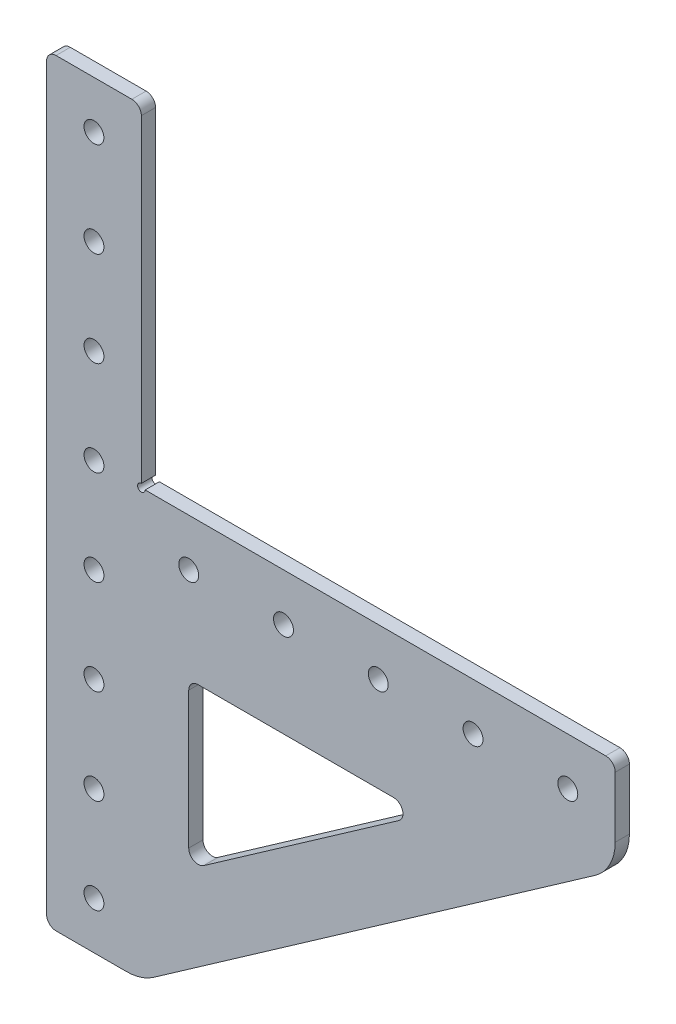
ISO-10303-21;
HEADER;
FILE_DESCRIPTION(('STEP AP214'),'2;1');
FILE_NAME('part.step','',(''),(''),'','','');
FILE_SCHEMA(('AUTOMOTIVE_DESIGN { 1 0 10303 214 1 1 1 1 }'));
ENDSEC;
DATA;
#1=APPLICATION_CONTEXT('core data for automotive mechanical design processes');
#2=APPLICATION_PROTOCOL_DEFINITION('international standard','automotive_design',2000,#1);
#3=PRODUCT_CONTEXT('',#1,'mechanical');
#4=PRODUCT('Part','Part','',(#3));
#5=PRODUCT_RELATED_PRODUCT_CATEGORY('part','',(#4));
#6=PRODUCT_DEFINITION_FORMATION('','',#4);
#7=PRODUCT_DEFINITION_CONTEXT('part definition',#1,'design');
#8=PRODUCT_DEFINITION('design','',#6,#7);
#9=PRODUCT_DEFINITION_SHAPE('','',#8);
#10=(LENGTH_UNIT() NAMED_UNIT(*) SI_UNIT(.MILLI.,.METRE.));
#11=(NAMED_UNIT(*) PLANE_ANGLE_UNIT() SI_UNIT($,.RADIAN.));
#12=(NAMED_UNIT(*) SI_UNIT($,.STERADIAN.) SOLID_ANGLE_UNIT());
#13=UNCERTAINTY_MEASURE_WITH_UNIT(LENGTH_MEASURE(1.E-05),#10,'distance_accuracy_value','');
#14=(GEOMETRIC_REPRESENTATION_CONTEXT(3) GLOBAL_UNCERTAINTY_ASSIGNED_CONTEXT((#13)) GLOBAL_UNIT_ASSIGNED_CONTEXT((#10,
#11,#12)) REPRESENTATION_CONTEXT('',''));
#15=CARTESIAN_POINT('',(0.,0.,0.));
#16=DIRECTION('',(0.,0.,1.));
#17=DIRECTION('',(1.,0.,0.));
#18=AXIS2_PLACEMENT_3D('',#15,#16,#17);
#19=CARTESIAN_POINT('',(0.,0.,3.));
#20=DIRECTION('',(0.,0.,-1.));
#21=DIRECTION('',(-1.,0.,0.));
#22=AXIS2_PLACEMENT_3D('',#19,#20,#21);
#23=PLANE('',#22);
#24=DIRECTION('',(0.,1.,0.));
#25=VECTOR('',#24,1.);
#26=CARTESIAN_POINT('',(-90.,-20.,3.));
#27=LINE('',#26,#25);
#28=CARTESIAN_POINT('',(-90.,-50.8488554532527,3.));
#29=VERTEX_POINT('',#28);
#30=CARTESIAN_POINT('',(-90.,-22.,3.));
#31=VERTEX_POINT('',#30);
#32=EDGE_CURVE('E475',#29,#31,#27,.T.);
#33=ORIENTED_EDGE('',*,*,#32,.T.);
#34=CARTESIAN_POINT('',(-88.,-22.,3.));
#35=DIRECTION('',(0.,0.,-1.));
#36=DIRECTION('',(-1.,0.,0.));
#37=AXIS2_PLACEMENT_3D('',#34,#35,#36);
#38=CIRCLE('',#37,2.);
#39=CARTESIAN_POINT('',(-88.,-20.,3.));
#40=VERTEX_POINT('',#39);
#41=EDGE_CURVE('E290',#31,#40,#38,.T.);
#42=ORIENTED_EDGE('',*,*,#41,.T.);
#43=DIRECTION('',(1.,0.,0.));
#44=VECTOR('',#43,1.);
#45=CARTESIAN_POINT('',(-40.4426191765722,-20.,3.));
#46=LINE('',#45,#44);
#47=CARTESIAN_POINT('',(-46.7873493524961,-20.,3.));
#48=VERTEX_POINT('',#47);
#49=EDGE_CURVE('E461',#40,#48,#46,.T.);
#50=ORIENTED_EDGE('',*,*,#49,.T.);
#51=CARTESIAN_POINT('',(-46.7873493524961,-22.,3.));
#52=DIRECTION('',(0.,0.,-1.));
#53=DIRECTION('',(-1.,0.,0.));
#54=AXIS2_PLACEMENT_3D('',#51,#52,#53);
#55=CIRCLE('',#54,2.);
#56=CARTESIAN_POINT('',(-45.6404246637695,-23.6384638410381,3.));
#57=VERTEX_POINT('',#56);
#58=EDGE_CURVE('E286',#48,#57,#55,.T.);
#59=ORIENTED_EDGE('',*,*,#58,.T.);
#60=DIRECTION('',(-0.819231920519041,-0.573462344363328,0.));
#61=VECTOR('',#60,1.);
#62=CARTESIAN_POINT('',(-40.4426191765722,-20.,3.));
#63=LINE('',#62,#61);
#64=CARTESIAN_POINT('',(-86.8530753112733,-52.4873192942908,3.));
#65=VERTEX_POINT('',#64);
#66=EDGE_CURVE('E466',#57,#65,#63,.T.);
#67=ORIENTED_EDGE('',*,*,#66,.T.);
#68=CARTESIAN_POINT('',(-88.,-50.8488554532527,3.));
#69=DIRECTION('',(0.,0.,-1.));
#70=DIRECTION('',(-1.,0.,0.));
#71=AXIS2_PLACEMENT_3D('',#68,#69,#70);
#72=CIRCLE('',#71,2.);
#73=EDGE_CURVE('E282',#65,#29,#72,.T.);
#74=ORIENTED_EDGE('',*,*,#73,.T.);
#75=EDGE_LOOP('',(#33,#42,#50,#59,#67,#74));
#76=FACE_BOUND('',#75,.T.);
#77=DIRECTION('',(1.,0.,0.));
#78=VECTOR('',#77,1.);
#79=CARTESIAN_POINT('',(-100.,-80.,3.));
#80=LINE('',#79,#78);
#81=CARTESIAN_POINT('',(-118.,-80.,3.));
#82=VERTEX_POINT('',#81);
#83=CARTESIAN_POINT('',(-103.152222308191,-80.,3.));
#84=VERTEX_POINT('',#83);
#85=EDGE_CURVE('E203',#82,#84,#80,.T.);
#86=ORIENTED_EDGE('',*,*,#85,.T.);
#87=CARTESIAN_POINT('',(-103.152222308191,-70.,3.));
#88=DIRECTION('',(0.,0.,-1.));
#89=DIRECTION('',(-1.,0.,0.));
#90=AXIS2_PLACEMENT_3D('',#87,#88,#89);
#91=CIRCLE('',#90,10.);
#92=CARTESIAN_POINT('',(-97.4175988645577,-78.1923192051904,3.));
#93=VERTEX_POINT('',#92);
#94=EDGE_CURVE('E41',#84,#93,#91,.F.);
#95=ORIENTED_EDGE('',*,*,#94,.T.);
#96=DIRECTION('',(0.81923192051904,0.573462344363328,0.));
#97=VECTOR('',#96,1.);
#98=CARTESIAN_POINT('',(0.,-10.,3.));
#99=LINE('',#98,#97);
#100=CARTESIAN_POINT('',(-4.26537655636672,-12.9857635894567,3.));
#101=VERTEX_POINT('',#100);
#102=EDGE_CURVE('E182',#93,#101,#99,.T.);
#103=ORIENTED_EDGE('',*,*,#102,.T.);
#104=CARTESIAN_POINT('',(-10.,-4.7934443842663,3.));
#105=DIRECTION('',(0.,0.,-1.));
#106=DIRECTION('',(-1.,0.,0.));
#107=AXIS2_PLACEMENT_3D('',#104,#105,#106);
#108=CIRCLE('',#107,10.);
#109=CARTESIAN_POINT('',(0.,-4.7934443842663,3.));
#110=VERTEX_POINT('',#109);
#111=EDGE_CURVE('E48',#101,#110,#108,.F.);
#112=ORIENTED_EDGE('',*,*,#111,.T.);
#113=DIRECTION('',(0.,1.,0.));
#114=VECTOR('',#113,1.);
#115=CARTESIAN_POINT('',(0.,10.,3.));
#116=LINE('',#115,#114);
#117=CARTESIAN_POINT('',(0.,8.,3.));
#118=VERTEX_POINT('',#117);
#119=EDGE_CURVE('E199',#110,#118,#116,.T.);
#120=ORIENTED_EDGE('',*,*,#119,.T.);
#121=CARTESIAN_POINT('',(-2.,8.,3.));
#122=DIRECTION('',(0.,0.,-1.));
#123=DIRECTION('',(-1.,0.,0.));
#124=AXIS2_PLACEMENT_3D('',#121,#122,#123);
#125=CIRCLE('',#124,2.);
#126=CARTESIAN_POINT('',(-2.,10.,3.));
#127=VERTEX_POINT('',#126);
#128=EDGE_CURVE('E197',#118,#127,#125,.F.);
#129=ORIENTED_EDGE('',*,*,#128,.T.);
#130=DIRECTION('',(-1.,0.,0.));
#131=VECTOR('',#130,1.);
#132=CARTESIAN_POINT('',(0.,10.,3.));
#133=LINE('',#132,#131);
#134=CARTESIAN_POINT('',(-99.2,9.99999999999999,3.));
#135=VERTEX_POINT('',#134);
#136=EDGE_CURVE('E189',#127,#135,#133,.T.);
#137=ORIENTED_EDGE('',*,*,#136,.T.);
#138=CARTESIAN_POINT('',(-100.,9.99999999999999,3.));
#139=DIRECTION('',(0.,0.,1.));
#140=DIRECTION('',(1.,0.,0.));
#141=AXIS2_PLACEMENT_3D('',#138,#139,#140);
#142=CIRCLE('',#141,0.799999999999995);
#143=CARTESIAN_POINT('',(-100.,10.8,3.));
#144=VERTEX_POINT('',#143);
#145=EDGE_CURVE('E172',#144,#135,#142,.T.);
#146=ORIENTED_EDGE('',*,*,#145,.F.);
#147=DIRECTION('',(0.,1.,0.));
#148=VECTOR('',#147,1.);
#149=CARTESIAN_POINT('',(-100.,9.99999999999999,3.));
#150=LINE('',#149,#148);
#151=CARTESIAN_POINT('',(-100.,78.,3.));
#152=VERTEX_POINT('',#151);
#153=EDGE_CURVE('E198',#144,#152,#150,.T.);
#154=ORIENTED_EDGE('',*,*,#153,.T.);
#155=CARTESIAN_POINT('',(-102.,78.,3.));
#156=DIRECTION('',(0.,0.,-1.));
#157=DIRECTION('',(-1.,0.,0.));
#158=AXIS2_PLACEMENT_3D('',#155,#156,#157);
#159=CIRCLE('',#158,2.);
#160=CARTESIAN_POINT('',(-102.,80.,3.));
#161=VERTEX_POINT('',#160);
#162=EDGE_CURVE('E247',#152,#161,#159,.F.);
#163=ORIENTED_EDGE('',*,*,#162,.T.);
#164=DIRECTION('',(-1.,0.,0.));
#165=VECTOR('',#164,1.);
#166=CARTESIAN_POINT('',(-100.,80.,3.));
#167=LINE('',#166,#165);
#168=CARTESIAN_POINT('',(-118.,80.,3.));
#169=VERTEX_POINT('',#168);
#170=EDGE_CURVE('E201',#161,#169,#167,.T.);
#171=ORIENTED_EDGE('',*,*,#170,.T.);
#172=CARTESIAN_POINT('',(-118.,78.,3.));
#173=DIRECTION('',(0.,0.,-1.));
#174=DIRECTION('',(-1.,0.,0.));
#175=AXIS2_PLACEMENT_3D('',#172,#173,#174);
#176=CIRCLE('',#175,2.);
#177=CARTESIAN_POINT('',(-120.,78.,3.));
#178=VERTEX_POINT('',#177);
#179=EDGE_CURVE('E244',#169,#178,#176,.F.);
#180=ORIENTED_EDGE('',*,*,#179,.T.);
#181=DIRECTION('',(0.,-1.,0.));
#182=VECTOR('',#181,1.);
#183=CARTESIAN_POINT('',(-120.,-80.,3.));
#184=LINE('',#183,#182);
#185=CARTESIAN_POINT('',(-120.,-78.,3.));
#186=VERTEX_POINT('',#185);
#187=EDGE_CURVE('E209',#178,#186,#184,.T.);
#188=ORIENTED_EDGE('',*,*,#187,.T.);
#189=CARTESIAN_POINT('',(-118.,-78.,3.));
#190=DIRECTION('',(0.,0.,-1.));
#191=DIRECTION('',(-1.,0.,0.));
#192=AXIS2_PLACEMENT_3D('',#189,#190,#191);
#193=CIRCLE('',#192,2.);
#194=EDGE_CURVE('E249',#186,#82,#193,.F.);
#195=ORIENTED_EDGE('',*,*,#194,.T.);
#196=EDGE_LOOP('',(#86,#95,#103,#112,#120,#129,#137,#146,#154,#163,#171,#180,#188,#195));
#197=FACE_BOUND('',#196,.T.);
#198=CARTESIAN_POINT('',(-110.,70.,3.));
#199=DIRECTION('',(0.,0.,1.));
#200=DIRECTION('',(1.,0.,0.));
#201=AXIS2_PLACEMENT_3D('',#198,#199,#200);
#202=CIRCLE('',#201,2.1);
#203=CARTESIAN_POINT('',(-107.9,70.,3.));
#204=VERTEX_POINT('',#203);
#205=EDGE_CURVE('E216',#204,#204,#202,.T.);
#206=ORIENTED_EDGE('',*,*,#205,.F.);
#207=EDGE_LOOP('',(#206));
#208=FACE_BOUND('',#207,.T.);
#209=CARTESIAN_POINT('',(-10.,0.,3.));
#210=DIRECTION('',(0.,0.,1.));
#211=DIRECTION('',(1.,0.,0.));
#212=AXIS2_PLACEMENT_3D('',#209,#210,#211);
#213=CIRCLE('',#212,2.1);
#214=CARTESIAN_POINT('',(-7.9,0.,3.));
#215=VERTEX_POINT('',#214);
#216=EDGE_CURVE('E386',#215,#215,#213,.T.);
#217=ORIENTED_EDGE('',*,*,#216,.F.);
#218=EDGE_LOOP('',(#217));
#219=FACE_BOUND('',#218,.T.);
#220=CARTESIAN_POINT('',(-110.,50.,3.));
#221=DIRECTION('',(0.,0.,1.));
#222=DIRECTION('',(1.,0.,0.));
#223=AXIS2_PLACEMENT_3D('',#220,#221,#222);
#224=CIRCLE('',#223,2.1);
#225=CARTESIAN_POINT('',(-107.9,50.,3.));
#226=VERTEX_POINT('',#225);
#227=EDGE_CURVE('E394',#226,#226,#224,.T.);
#228=ORIENTED_EDGE('',*,*,#227,.F.);
#229=EDGE_LOOP('',(#228));
#230=FACE_BOUND('',#229,.T.);
#231=CARTESIAN_POINT('',(-110.,30.,3.));
#232=DIRECTION('',(0.,0.,1.));
#233=DIRECTION('',(1.,0.,0.));
#234=AXIS2_PLACEMENT_3D('',#231,#232,#233);
#235=CIRCLE('',#234,2.10000000000002);
#236=CARTESIAN_POINT('',(-107.9,30.,3.));
#237=VERTEX_POINT('',#236);
#238=EDGE_CURVE('E399',#237,#237,#235,.T.);
#239=ORIENTED_EDGE('',*,*,#238,.F.);
#240=EDGE_LOOP('',(#239));
#241=FACE_BOUND('',#240,.T.);
#242=CARTESIAN_POINT('',(-110.,10.,3.));
#243=DIRECTION('',(0.,0.,1.));
#244=DIRECTION('',(1.,0.,0.));
#245=AXIS2_PLACEMENT_3D('',#242,#243,#244);
#246=CIRCLE('',#245,2.1);
#247=CARTESIAN_POINT('',(-107.9,10.,3.));
#248=VERTEX_POINT('',#247);
#249=EDGE_CURVE('E405',#248,#248,#246,.T.);
#250=ORIENTED_EDGE('',*,*,#249,.F.);
#251=EDGE_LOOP('',(#250));
#252=FACE_BOUND('',#251,.T.);
#253=CARTESIAN_POINT('',(-110.,-9.99999999999999,3.));
#254=DIRECTION('',(0.,0.,1.));
#255=DIRECTION('',(1.,0.,0.));
#256=AXIS2_PLACEMENT_3D('',#253,#254,#255);
#257=CIRCLE('',#256,2.1);
#258=CARTESIAN_POINT('',(-107.9,-9.99999999999999,3.));
#259=VERTEX_POINT('',#258);
#260=EDGE_CURVE('E411',#259,#259,#257,.T.);
#261=ORIENTED_EDGE('',*,*,#260,.F.);
#262=EDGE_LOOP('',(#261));
#263=FACE_BOUND('',#262,.T.);
#264=CARTESIAN_POINT('',(-110.,-30.,3.));
#265=DIRECTION('',(0.,0.,1.));
#266=DIRECTION('',(1.,0.,0.));
#267=AXIS2_PLACEMENT_3D('',#264,#265,#266);
#268=CIRCLE('',#267,2.1);
#269=CARTESIAN_POINT('',(-107.9,-30.,3.));
#270=VERTEX_POINT('',#269);
#271=EDGE_CURVE('E417',#270,#270,#268,.T.);
#272=ORIENTED_EDGE('',*,*,#271,.F.);
#273=EDGE_LOOP('',(#272));
#274=FACE_BOUND('',#273,.T.);
#275=CARTESIAN_POINT('',(-110.,-50.,3.));
#276=DIRECTION('',(0.,0.,1.));
#277=DIRECTION('',(1.,0.,0.));
#278=AXIS2_PLACEMENT_3D('',#275,#276,#277);
#279=CIRCLE('',#278,2.09999999999999);
#280=CARTESIAN_POINT('',(-107.9,-50.,3.));
#281=VERTEX_POINT('',#280);
#282=EDGE_CURVE('E423',#281,#281,#279,.T.);
#283=ORIENTED_EDGE('',*,*,#282,.F.);
#284=EDGE_LOOP('',(#283));
#285=FACE_BOUND('',#284,.T.);
#286=CARTESIAN_POINT('',(-110.,-70.,3.));
#287=DIRECTION('',(0.,0.,1.));
#288=DIRECTION('',(1.,0.,0.));
#289=AXIS2_PLACEMENT_3D('',#286,#287,#288);
#290=CIRCLE('',#289,2.1);
#291=CARTESIAN_POINT('',(-107.9,-70.,3.));
#292=VERTEX_POINT('',#291);
#293=EDGE_CURVE('E429',#292,#292,#290,.T.);
#294=ORIENTED_EDGE('',*,*,#293,.F.);
#295=EDGE_LOOP('',(#294));
#296=FACE_BOUND('',#295,.T.);
#297=CARTESIAN_POINT('',(-30.,0.,3.));
#298=DIRECTION('',(0.,0.,1.));
#299=DIRECTION('',(1.,0.,0.));
#300=AXIS2_PLACEMENT_3D('',#297,#298,#299);
#301=CIRCLE('',#300,2.1);
#302=CARTESIAN_POINT('',(-27.9,0.,3.));
#303=VERTEX_POINT('',#302);
#304=EDGE_CURVE('E435',#303,#303,#301,.T.);
#305=ORIENTED_EDGE('',*,*,#304,.F.);
#306=EDGE_LOOP('',(#305));
#307=FACE_BOUND('',#306,.T.);
#308=CARTESIAN_POINT('',(-50.,0.,3.));
#309=DIRECTION('',(0.,0.,1.));
#310=DIRECTION('',(1.,0.,0.));
#311=AXIS2_PLACEMENT_3D('',#308,#309,#310);
#312=CIRCLE('',#311,2.1);
#313=CARTESIAN_POINT('',(-47.9,0.,3.));
#314=VERTEX_POINT('',#313);
#315=EDGE_CURVE('E441',#314,#314,#312,.T.);
#316=ORIENTED_EDGE('',*,*,#315,.F.);
#317=EDGE_LOOP('',(#316));
#318=FACE_BOUND('',#317,.T.);
#319=CARTESIAN_POINT('',(-70.,0.,3.));
#320=DIRECTION('',(0.,0.,1.));
#321=DIRECTION('',(1.,0.,0.));
#322=AXIS2_PLACEMENT_3D('',#319,#320,#321);
#323=CIRCLE('',#322,2.1);
#324=CARTESIAN_POINT('',(-67.9,0.,3.));
#325=VERTEX_POINT('',#324);
#326=EDGE_CURVE('E447',#325,#325,#323,.T.);
#327=ORIENTED_EDGE('',*,*,#326,.F.);
#328=EDGE_LOOP('',(#327));
#329=FACE_BOUND('',#328,.T.);
#330=CARTESIAN_POINT('',(-90.,0.,3.));
#331=DIRECTION('',(0.,0.,1.));
#332=DIRECTION('',(1.,0.,0.));
#333=AXIS2_PLACEMENT_3D('',#330,#331,#332);
#334=CIRCLE('',#333,2.09999999999999);
#335=CARTESIAN_POINT('',(-87.9,0.,3.));
#336=VERTEX_POINT('',#335);
#337=EDGE_CURVE('E453',#336,#336,#334,.T.);
#338=ORIENTED_EDGE('',*,*,#337,.F.);
#339=EDGE_LOOP('',(#338));
#340=FACE_BOUND('',#339,.T.);
#341=ADVANCED_FACE('F33',(#76,#197,#208,#219,#230,#241,#252,#263,#274,#285,#296,#307,#318,#329,
#340),#23,.F.);
#342=CARTESIAN_POINT('',(0.,0.,0.));
#343=DIRECTION('',(0.,0.,-1.));
#344=DIRECTION('',(-1.,0.,0.));
#345=AXIS2_PLACEMENT_3D('',#342,#343,#344);
#346=PLANE('',#345);
#347=DIRECTION('',(-0.819231920519041,-0.573462344363328,0.));
#348=VECTOR('',#347,1.);
#349=CARTESIAN_POINT('',(-40.4426191765722,-20.,0.));
#350=LINE('',#349,#348);
#351=CARTESIAN_POINT('',(-45.6404246637695,-23.6384638410381,0.));
#352=VERTEX_POINT('',#351);
#353=CARTESIAN_POINT('',(-86.8530753112733,-52.4873192942908,0.));
#354=VERTEX_POINT('',#353);
#355=EDGE_CURVE('E470',#352,#354,#350,.T.);
#356=ORIENTED_EDGE('',*,*,#355,.F.);
#357=CARTESIAN_POINT('',(-46.7873493524961,-22.,0.));
#358=DIRECTION('',(0.,0.,-1.));
#359=DIRECTION('',(-1.,0.,0.));
#360=AXIS2_PLACEMENT_3D('',#357,#358,#359);
#361=CIRCLE('',#360,2.);
#362=CARTESIAN_POINT('',(-46.7873493524961,-20.,0.));
#363=VERTEX_POINT('',#362);
#364=EDGE_CURVE('E284',#352,#363,#361,.F.);
#365=ORIENTED_EDGE('',*,*,#364,.T.);
#366=DIRECTION('',(1.,0.,0.));
#367=VECTOR('',#366,1.);
#368=CARTESIAN_POINT('',(-40.4426191765722,-20.,0.));
#369=LINE('',#368,#367);
#370=CARTESIAN_POINT('',(-88.,-20.,0.));
#371=VERTEX_POINT('',#370);
#372=EDGE_CURVE('E463',#371,#363,#369,.T.);
#373=ORIENTED_EDGE('',*,*,#372,.F.);
#374=CARTESIAN_POINT('',(-88.,-22.,0.));
#375=DIRECTION('',(0.,0.,-1.));
#376=DIRECTION('',(-1.,0.,0.));
#377=AXIS2_PLACEMENT_3D('',#374,#375,#376);
#378=CIRCLE('',#377,2.);
#379=CARTESIAN_POINT('',(-90.,-22.,0.));
#380=VERTEX_POINT('',#379);
#381=EDGE_CURVE('E288',#371,#380,#378,.F.);
#382=ORIENTED_EDGE('',*,*,#381,.T.);
#383=DIRECTION('',(0.,1.,0.));
#384=VECTOR('',#383,1.);
#385=CARTESIAN_POINT('',(-90.,-20.,0.));
#386=LINE('',#385,#384);
#387=CARTESIAN_POINT('',(-90.,-50.8488554532527,0.));
#388=VERTEX_POINT('',#387);
#389=EDGE_CURVE('E467',#388,#380,#386,.T.);
#390=ORIENTED_EDGE('',*,*,#389,.F.);
#391=CARTESIAN_POINT('',(-88.,-50.8488554532527,0.));
#392=DIRECTION('',(0.,0.,-1.));
#393=DIRECTION('',(-1.,0.,0.));
#394=AXIS2_PLACEMENT_3D('',#391,#392,#393);
#395=CIRCLE('',#394,2.);
#396=EDGE_CURVE('E280',#388,#354,#395,.F.);
#397=ORIENTED_EDGE('',*,*,#396,.T.);
#398=EDGE_LOOP('',(#356,#365,#373,#382,#390,#397));
#399=FACE_BOUND('',#398,.T.);
#400=DIRECTION('',(-0.81923192051904,-0.573462344363328,0.));
#401=VECTOR('',#400,1.);
#402=CARTESIAN_POINT('',(0.,-10.,0.));
#403=LINE('',#402,#401);
#404=CARTESIAN_POINT('',(-4.26537655636672,-12.9857635894567,0.));
#405=VERTEX_POINT('',#404);
#406=CARTESIAN_POINT('',(-97.4175988645577,-78.1923192051904,0.));
#407=VERTEX_POINT('',#406);
#408=EDGE_CURVE('E311',#405,#407,#403,.T.);
#409=ORIENTED_EDGE('',*,*,#408,.T.);
#410=CARTESIAN_POINT('',(-103.152222308191,-70.,0.));
#411=DIRECTION('',(0.,0.,-1.));
#412=DIRECTION('',(-1.,0.,0.));
#413=AXIS2_PLACEMENT_3D('',#410,#411,#412);
#414=CIRCLE('',#413,10.);
#415=CARTESIAN_POINT('',(-103.152222308191,-80.,0.));
#416=VERTEX_POINT('',#415);
#417=EDGE_CURVE('E299',#407,#416,#414,.T.);
#418=ORIENTED_EDGE('',*,*,#417,.T.);
#419=DIRECTION('',(1.,0.,0.));
#420=VECTOR('',#419,1.);
#421=CARTESIAN_POINT('',(-100.,-80.,0.));
#422=LINE('',#421,#420);
#423=CARTESIAN_POINT('',(-118.,-80.,0.));
#424=VERTEX_POINT('',#423);
#425=EDGE_CURVE('E213',#424,#416,#422,.T.);
#426=ORIENTED_EDGE('',*,*,#425,.F.);
#427=CARTESIAN_POINT('',(-118.,-78.,0.));
#428=DIRECTION('',(0.,0.,-1.));
#429=DIRECTION('',(-1.,0.,0.));
#430=AXIS2_PLACEMENT_3D('',#427,#428,#429);
#431=CIRCLE('',#430,2.);
#432=CARTESIAN_POINT('',(-120.,-78.,0.));
#433=VERTEX_POINT('',#432);
#434=EDGE_CURVE('E237',#424,#433,#431,.T.);
#435=ORIENTED_EDGE('',*,*,#434,.T.);
#436=DIRECTION('',(0.,-1.,0.));
#437=VECTOR('',#436,1.);
#438=CARTESIAN_POINT('',(-120.,-80.,0.));
#439=LINE('',#438,#437);
#440=CARTESIAN_POINT('',(-120.,78.,0.));
#441=VERTEX_POINT('',#440);
#442=EDGE_CURVE('E224',#441,#433,#439,.T.);
#443=ORIENTED_EDGE('',*,*,#442,.F.);
#444=CARTESIAN_POINT('',(-118.,78.,0.));
#445=DIRECTION('',(0.,0.,-1.));
#446=DIRECTION('',(-1.,0.,0.));
#447=AXIS2_PLACEMENT_3D('',#444,#445,#446);
#448=CIRCLE('',#447,2.);
#449=CARTESIAN_POINT('',(-118.,80.,0.));
#450=VERTEX_POINT('',#449);
#451=EDGE_CURVE('E229',#441,#450,#448,.T.);
#452=ORIENTED_EDGE('',*,*,#451,.T.);
#453=DIRECTION('',(-1.,0.,0.));
#454=VECTOR('',#453,1.);
#455=CARTESIAN_POINT('',(-100.,80.,0.));
#456=LINE('',#455,#454);
#457=CARTESIAN_POINT('',(-102.,80.,0.));
#458=VERTEX_POINT('',#457);
#459=EDGE_CURVE('E221',#458,#450,#456,.T.);
#460=ORIENTED_EDGE('',*,*,#459,.F.);
#461=CARTESIAN_POINT('',(-102.,78.,0.));
#462=DIRECTION('',(0.,0.,-1.));
#463=DIRECTION('',(-1.,0.,0.));
#464=AXIS2_PLACEMENT_3D('',#461,#462,#463);
#465=CIRCLE('',#464,2.);
#466=CARTESIAN_POINT('',(-100.,78.,0.));
#467=VERTEX_POINT('',#466);
#468=EDGE_CURVE('E234',#458,#467,#465,.T.);
#469=ORIENTED_EDGE('',*,*,#468,.T.);
#470=DIRECTION('',(0.,1.,0.));
#471=VECTOR('',#470,1.);
#472=CARTESIAN_POINT('',(-100.,9.99999999999999,0.));
#473=LINE('',#472,#471);
#474=CARTESIAN_POINT('',(-100.,10.8,0.));
#475=VERTEX_POINT('',#474);
#476=EDGE_CURVE('E219',#475,#467,#473,.T.);
#477=ORIENTED_EDGE('',*,*,#476,.F.);
#478=CARTESIAN_POINT('',(-100.,9.99999999999999,0.));
#479=DIRECTION('',(0.,0.,1.));
#480=DIRECTION('',(1.,0.,0.));
#481=AXIS2_PLACEMENT_3D('',#478,#479,#480);
#482=CIRCLE('',#481,0.799999999999995);
#483=CARTESIAN_POINT('',(-99.2,9.99999999999999,0.));
#484=VERTEX_POINT('',#483);
#485=EDGE_CURVE('E181',#475,#484,#482,.T.);
#486=ORIENTED_EDGE('',*,*,#485,.T.);
#487=DIRECTION('',(-1.,0.,0.));
#488=VECTOR('',#487,1.);
#489=CARTESIAN_POINT('',(0.,10.,0.));
#490=LINE('',#489,#488);
#491=CARTESIAN_POINT('',(-2.,10.,0.));
#492=VERTEX_POINT('',#491);
#493=EDGE_CURVE('E192',#492,#484,#490,.T.);
#494=ORIENTED_EDGE('',*,*,#493,.F.);
#495=CARTESIAN_POINT('',(-2.,8.,0.));
#496=DIRECTION('',(0.,0.,-1.));
#497=DIRECTION('',(-1.,0.,0.));
#498=AXIS2_PLACEMENT_3D('',#495,#496,#497);
#499=CIRCLE('',#498,2.);
#500=CARTESIAN_POINT('',(0.,8.,0.));
#501=VERTEX_POINT('',#500);
#502=EDGE_CURVE('E231',#492,#501,#499,.T.);
#503=ORIENTED_EDGE('',*,*,#502,.T.);
#504=DIRECTION('',(0.,1.,0.));
#505=VECTOR('',#504,1.);
#506=CARTESIAN_POINT('',(0.,10.,0.));
#507=LINE('',#506,#505);
#508=CARTESIAN_POINT('',(0.,-4.7934443842663,0.));
#509=VERTEX_POINT('',#508);
#510=EDGE_CURVE('E215',#509,#501,#507,.T.);
#511=ORIENTED_EDGE('',*,*,#510,.F.);
#512=CARTESIAN_POINT('',(-10.,-4.7934443842663,0.));
#513=DIRECTION('',(0.,0.,-1.));
#514=DIRECTION('',(-1.,0.,0.));
#515=AXIS2_PLACEMENT_3D('',#512,#513,#514);
#516=CIRCLE('',#515,10.);
#517=EDGE_CURVE('E297',#509,#405,#516,.T.);
#518=ORIENTED_EDGE('',*,*,#517,.T.);
#519=EDGE_LOOP('',(#409,#418,#426,#435,#443,#452,#460,#469,#477,#486,#494,#503,#511,#518));
#520=FACE_BOUND('',#519,.T.);
#521=CARTESIAN_POINT('',(-70.,0.,0.));
#522=DIRECTION('',(0.,0.,1.));
#523=DIRECTION('',(1.,0.,0.));
#524=AXIS2_PLACEMENT_3D('',#521,#522,#523);
#525=CIRCLE('',#524,2.1);
#526=CARTESIAN_POINT('',(-67.9,0.,0.));
#527=VERTEX_POINT('',#526);
#528=EDGE_CURVE('E450',#527,#527,#525,.T.);
#529=ORIENTED_EDGE('',*,*,#528,.T.);
#530=EDGE_LOOP('',(#529));
#531=FACE_BOUND('',#530,.T.);
#532=CARTESIAN_POINT('',(-30.,0.,0.));
#533=DIRECTION('',(0.,0.,1.));
#534=DIRECTION('',(1.,0.,0.));
#535=AXIS2_PLACEMENT_3D('',#532,#533,#534);
#536=CIRCLE('',#535,2.1);
#537=CARTESIAN_POINT('',(-27.9,0.,0.));
#538=VERTEX_POINT('',#537);
#539=EDGE_CURVE('E438',#538,#538,#536,.T.);
#540=ORIENTED_EDGE('',*,*,#539,.T.);
#541=EDGE_LOOP('',(#540));
#542=FACE_BOUND('',#541,.T.);
#543=CARTESIAN_POINT('',(-110.,-50.,0.));
#544=DIRECTION('',(0.,0.,1.));
#545=DIRECTION('',(1.,0.,0.));
#546=AXIS2_PLACEMENT_3D('',#543,#544,#545);
#547=CIRCLE('',#546,2.09999999999999);
#548=CARTESIAN_POINT('',(-107.9,-50.,0.));
#549=VERTEX_POINT('',#548);
#550=EDGE_CURVE('E426',#549,#549,#547,.T.);
#551=ORIENTED_EDGE('',*,*,#550,.T.);
#552=EDGE_LOOP('',(#551));
#553=FACE_BOUND('',#552,.T.);
#554=CARTESIAN_POINT('',(-110.,-9.99999999999999,0.));
#555=DIRECTION('',(0.,0.,1.));
#556=DIRECTION('',(1.,0.,0.));
#557=AXIS2_PLACEMENT_3D('',#554,#555,#556);
#558=CIRCLE('',#557,2.1);
#559=CARTESIAN_POINT('',(-107.9,-9.99999999999999,0.));
#560=VERTEX_POINT('',#559);
#561=EDGE_CURVE('E414',#560,#560,#558,.T.);
#562=ORIENTED_EDGE('',*,*,#561,.T.);
#563=EDGE_LOOP('',(#562));
#564=FACE_BOUND('',#563,.T.);
#565=CARTESIAN_POINT('',(-110.,30.,0.));
#566=DIRECTION('',(0.,0.,1.));
#567=DIRECTION('',(1.,0.,0.));
#568=AXIS2_PLACEMENT_3D('',#565,#566,#567);
#569=CIRCLE('',#568,2.10000000000002);
#570=CARTESIAN_POINT('',(-107.9,30.,0.));
#571=VERTEX_POINT('',#570);
#572=EDGE_CURVE('E402',#571,#571,#569,.T.);
#573=ORIENTED_EDGE('',*,*,#572,.T.);
#574=EDGE_LOOP('',(#573));
#575=FACE_BOUND('',#574,.T.);
#576=CARTESIAN_POINT('',(-10.,0.,0.));
#577=DIRECTION('',(0.,0.,1.));
#578=DIRECTION('',(1.,0.,0.));
#579=AXIS2_PLACEMENT_3D('',#576,#577,#578);
#580=CIRCLE('',#579,2.1);
#581=CARTESIAN_POINT('',(-7.9,0.,0.));
#582=VERTEX_POINT('',#581);
#583=EDGE_CURVE('E390',#582,#582,#580,.T.);
#584=ORIENTED_EDGE('',*,*,#583,.T.);
#585=EDGE_LOOP('',(#584));
#586=FACE_BOUND('',#585,.T.);
#587=CARTESIAN_POINT('',(-110.,70.,0.));
#588=DIRECTION('',(0.,0.,1.));
#589=DIRECTION('',(1.,0.,0.));
#590=AXIS2_PLACEMENT_3D('',#587,#588,#589);
#591=CIRCLE('',#590,2.1);
#592=CARTESIAN_POINT('',(-107.9,70.,0.));
#593=VERTEX_POINT('',#592);
#594=EDGE_CURVE('E384',#593,#593,#591,.T.);
#595=ORIENTED_EDGE('',*,*,#594,.T.);
#596=EDGE_LOOP('',(#595));
#597=FACE_BOUND('',#596,.T.);
#598=CARTESIAN_POINT('',(-110.,50.,0.));
#599=DIRECTION('',(0.,0.,1.));
#600=DIRECTION('',(1.,0.,0.));
#601=AXIS2_PLACEMENT_3D('',#598,#599,#600);
#602=CIRCLE('',#601,2.1);
#603=CARTESIAN_POINT('',(-107.9,50.,0.));
#604=VERTEX_POINT('',#603);
#605=EDGE_CURVE('E396',#604,#604,#602,.T.);
#606=ORIENTED_EDGE('',*,*,#605,.T.);
#607=EDGE_LOOP('',(#606));
#608=FACE_BOUND('',#607,.T.);
#609=CARTESIAN_POINT('',(-110.,10.,0.));
#610=DIRECTION('',(0.,0.,1.));
#611=DIRECTION('',(1.,0.,0.));
#612=AXIS2_PLACEMENT_3D('',#609,#610,#611);
#613=CIRCLE('',#612,2.1);
#614=CARTESIAN_POINT('',(-107.9,10.,0.));
#615=VERTEX_POINT('',#614);
#616=EDGE_CURVE('E408',#615,#615,#613,.T.);
#617=ORIENTED_EDGE('',*,*,#616,.T.);
#618=EDGE_LOOP('',(#617));
#619=FACE_BOUND('',#618,.T.);
#620=CARTESIAN_POINT('',(-110.,-30.,0.));
#621=DIRECTION('',(0.,0.,1.));
#622=DIRECTION('',(1.,0.,0.));
#623=AXIS2_PLACEMENT_3D('',#620,#621,#622);
#624=CIRCLE('',#623,2.1);
#625=CARTESIAN_POINT('',(-107.9,-30.,0.));
#626=VERTEX_POINT('',#625);
#627=EDGE_CURVE('E420',#626,#626,#624,.T.);
#628=ORIENTED_EDGE('',*,*,#627,.T.);
#629=EDGE_LOOP('',(#628));
#630=FACE_BOUND('',#629,.T.);
#631=CARTESIAN_POINT('',(-110.,-70.,0.));
#632=DIRECTION('',(0.,0.,1.));
#633=DIRECTION('',(1.,0.,0.));
#634=AXIS2_PLACEMENT_3D('',#631,#632,#633);
#635=CIRCLE('',#634,2.1);
#636=CARTESIAN_POINT('',(-107.9,-70.,0.));
#637=VERTEX_POINT('',#636);
#638=EDGE_CURVE('E432',#637,#637,#635,.T.);
#639=ORIENTED_EDGE('',*,*,#638,.T.);
#640=EDGE_LOOP('',(#639));
#641=FACE_BOUND('',#640,.T.);
#642=CARTESIAN_POINT('',(-50.,0.,0.));
#643=DIRECTION('',(0.,0.,1.));
#644=DIRECTION('',(1.,0.,0.));
#645=AXIS2_PLACEMENT_3D('',#642,#643,#644);
#646=CIRCLE('',#645,2.1);
#647=CARTESIAN_POINT('',(-47.9,0.,0.));
#648=VERTEX_POINT('',#647);
#649=EDGE_CURVE('E444',#648,#648,#646,.T.);
#650=ORIENTED_EDGE('',*,*,#649,.T.);
#651=EDGE_LOOP('',(#650));
#652=FACE_BOUND('',#651,.T.);
#653=CARTESIAN_POINT('',(-90.,0.,0.));
#654=DIRECTION('',(0.,0.,1.));
#655=DIRECTION('',(1.,0.,0.));
#656=AXIS2_PLACEMENT_3D('',#653,#654,#655);
#657=CIRCLE('',#656,2.09999999999999);
#658=CARTESIAN_POINT('',(-87.9,0.,0.));
#659=VERTEX_POINT('',#658);
#660=EDGE_CURVE('E193',#659,#659,#657,.T.);
#661=ORIENTED_EDGE('',*,*,#660,.T.);
#662=EDGE_LOOP('',(#661));
#663=FACE_BOUND('',#662,.T.);
#664=ADVANCED_FACE('F316',(#399,#520,#531,#542,#553,#564,#575,#586,#597,#608,#619,#630,#641,
#652,#663),#346,.T.);
#665=CARTESIAN_POINT('',(-100.,-80.,3.));
#666=DIRECTION('',(0.,1.,0.));
#667=DIRECTION('',(0.,0.,1.));
#668=AXIS2_PLACEMENT_3D('',#665,#666,#667);
#669=PLANE('',#668);
#670=ORIENTED_EDGE('',*,*,#425,.T.);
#671=DIRECTION('',(0.,0.,-1.));
#672=VECTOR('',#671,1.);
#673=CARTESIAN_POINT('',(-103.152222308191,-80.,3.));
#674=LINE('',#673,#672);
#675=EDGE_CURVE('E56',#416,#84,#674,.F.);
#676=ORIENTED_EDGE('',*,*,#675,.T.);
#677=ORIENTED_EDGE('',*,*,#85,.F.);
#678=DIRECTION('',(0.,0.,-1.));
#679=VECTOR('',#678,1.);
#680=CARTESIAN_POINT('',(-118.,-80.,3.));
#681=LINE('',#680,#679);
#682=EDGE_CURVE('E212',#82,#424,#681,.T.);
#683=ORIENTED_EDGE('',*,*,#682,.T.);
#684=EDGE_LOOP('',(#670,#676,#677,#683));
#685=FACE_BOUND('',#684,.T.);
#686=ADVANCED_FACE('F318',(#685),#669,.F.);
#687=CARTESIAN_POINT('',(0.,10.,3.));
#688=DIRECTION('',(-1.,0.,0.));
#689=DIRECTION('',(0.,0.,1.));
#690=AXIS2_PLACEMENT_3D('',#687,#688,#689);
#691=PLANE('',#690);
#692=ORIENTED_EDGE('',*,*,#119,.F.);
#693=DIRECTION('',(0.,0.,-1.));
#694=VECTOR('',#693,1.);
#695=CARTESIAN_POINT('',(0.,-4.7934443842663,0.));
#696=LINE('',#695,#694);
#697=EDGE_CURVE('E11',#110,#509,#696,.T.);
#698=ORIENTED_EDGE('',*,*,#697,.T.);
#699=ORIENTED_EDGE('',*,*,#510,.T.);
#700=DIRECTION('',(0.,0.,-1.));
#701=VECTOR('',#700,1.);
#702=CARTESIAN_POINT('',(0.,8.,3.));
#703=LINE('',#702,#701);
#704=EDGE_CURVE('E261',#501,#118,#703,.F.);
#705=ORIENTED_EDGE('',*,*,#704,.T.);
#706=EDGE_LOOP('',(#692,#698,#699,#705));
#707=FACE_BOUND('',#706,.T.);
#708=ADVANCED_FACE('F352',(#707),#691,.F.);
#709=CARTESIAN_POINT('',(0.,10.,3.));
#710=DIRECTION('',(0.,-1.,0.));
#711=DIRECTION('',(1.,0.,0.));
#712=AXIS2_PLACEMENT_3D('',#709,#710,#711);
#713=PLANE('',#712);
#714=ORIENTED_EDGE('',*,*,#493,.T.);
#715=DIRECTION('',(0.,0.,1.));
#716=VECTOR('',#715,1.);
#717=CARTESIAN_POINT('',(-99.2,9.99999999999999,0.));
#718=LINE('',#717,#716);
#719=EDGE_CURVE('E175',#484,#135,#718,.T.);
#720=ORIENTED_EDGE('',*,*,#719,.T.);
#721=ORIENTED_EDGE('',*,*,#136,.F.);
#722=DIRECTION('',(0.,0.,-1.));
#723=VECTOR('',#722,1.);
#724=CARTESIAN_POINT('',(-2.,10.,3.));
#725=LINE('',#724,#723);
#726=EDGE_CURVE('E259',#127,#492,#725,.T.);
#727=ORIENTED_EDGE('',*,*,#726,.T.);
#728=EDGE_LOOP('',(#714,#720,#721,#727));
#729=FACE_BOUND('',#728,.T.);
#730=ADVANCED_FACE('F187',(#729),#713,.F.);
#731=CARTESIAN_POINT('',(-100.,9.99999999999999,3.));
#732=DIRECTION('',(-1.,0.,0.));
#733=DIRECTION('',(0.,0.,1.));
#734=AXIS2_PLACEMENT_3D('',#731,#732,#733);
#735=PLANE('',#734);
#736=ORIENTED_EDGE('',*,*,#153,.F.);
#737=DIRECTION('',(0.,0.,1.));
#738=VECTOR('',#737,1.);
#739=CARTESIAN_POINT('',(-100.,10.8,0.));
#740=LINE('',#739,#738);
#741=EDGE_CURVE('E178',#144,#475,#740,.F.);
#742=ORIENTED_EDGE('',*,*,#741,.T.);
#743=ORIENTED_EDGE('',*,*,#476,.T.);
#744=DIRECTION('',(0.,0.,-1.));
#745=VECTOR('',#744,1.);
#746=CARTESIAN_POINT('',(-100.,78.,3.));
#747=LINE('',#746,#745);
#748=EDGE_CURVE('E256',#467,#152,#747,.F.);
#749=ORIENTED_EDGE('',*,*,#748,.T.);
#750=EDGE_LOOP('',(#736,#742,#743,#749));
#751=FACE_BOUND('',#750,.T.);
#752=ADVANCED_FACE('F344',(#751),#735,.F.);
#753=CARTESIAN_POINT('',(-100.,80.,3.));
#754=DIRECTION('',(0.,-1.,0.));
#755=DIRECTION('',(0.,0.,-1.));
#756=AXIS2_PLACEMENT_3D('',#753,#754,#755);
#757=PLANE('',#756);
#758=ORIENTED_EDGE('',*,*,#170,.F.);
#759=DIRECTION('',(0.,0.,-1.));
#760=VECTOR('',#759,1.);
#761=CARTESIAN_POINT('',(-102.,80.,3.));
#762=LINE('',#761,#760);
#763=EDGE_CURVE('E253',#161,#458,#762,.T.);
#764=ORIENTED_EDGE('',*,*,#763,.T.);
#765=ORIENTED_EDGE('',*,*,#459,.T.);
#766=DIRECTION('',(0.,0.,-1.));
#767=VECTOR('',#766,1.);
#768=CARTESIAN_POINT('',(-118.,80.,3.));
#769=LINE('',#768,#767);
#770=EDGE_CURVE('E251',#450,#169,#769,.F.);
#771=ORIENTED_EDGE('',*,*,#770,.T.);
#772=EDGE_LOOP('',(#758,#764,#765,#771));
#773=FACE_BOUND('',#772,.T.);
#774=ADVANCED_FACE('F336',(#773),#757,.F.);
#775=CARTESIAN_POINT('',(-120.,-80.,3.));
#776=DIRECTION('',(1.,0.,0.));
#777=DIRECTION('',(0.,0.,-1.));
#778=AXIS2_PLACEMENT_3D('',#775,#776,#777);
#779=PLANE('',#778);
#780=ORIENTED_EDGE('',*,*,#442,.T.);
#781=DIRECTION('',(0.,0.,-1.));
#782=VECTOR('',#781,1.);
#783=CARTESIAN_POINT('',(-120.,-78.,3.));
#784=LINE('',#783,#782);
#785=EDGE_CURVE('E242',#433,#186,#784,.F.);
#786=ORIENTED_EDGE('',*,*,#785,.T.);
#787=ORIENTED_EDGE('',*,*,#187,.F.);
#788=DIRECTION('',(0.,0.,-1.));
#789=VECTOR('',#788,1.);
#790=CARTESIAN_POINT('',(-120.,78.,3.));
#791=LINE('',#790,#789);
#792=EDGE_CURVE('E239',#178,#441,#791,.T.);
#793=ORIENTED_EDGE('',*,*,#792,.T.);
#794=EDGE_LOOP('',(#780,#786,#787,#793));
#795=FACE_BOUND('',#794,.T.);
#796=ADVANCED_FACE('F326',(#795),#779,.F.);
#797=CARTESIAN_POINT('',(-110.,70.,3.));
#798=DIRECTION('',(0.,0.,-1.));
#799=DIRECTION('',(-1.,0.,0.));
#800=AXIS2_PLACEMENT_3D('',#797,#798,#799);
#801=CYLINDRICAL_SURFACE('',#800,2.1);
#802=ORIENTED_EDGE('',*,*,#205,.T.);
#803=EDGE_LOOP('',(#802));
#804=FACE_BOUND('',#803,.T.);
#805=ORIENTED_EDGE('',*,*,#594,.F.);
#806=EDGE_LOOP('',(#805));
#807=FACE_BOUND('',#806,.T.);
#808=ADVANCED_FACE('F365',(#804,#807),#801,.F.);
#809=CARTESIAN_POINT('',(-10.,0.,3.));
#810=DIRECTION('',(0.,0.,-1.));
#811=DIRECTION('',(-1.,0.,0.));
#812=AXIS2_PLACEMENT_3D('',#809,#810,#811);
#813=CYLINDRICAL_SURFACE('',#812,2.1);
#814=ORIENTED_EDGE('',*,*,#216,.T.);
#815=EDGE_LOOP('',(#814));
#816=FACE_BOUND('',#815,.T.);
#817=ORIENTED_EDGE('',*,*,#583,.F.);
#818=EDGE_LOOP('',(#817));
#819=FACE_BOUND('',#818,.T.);
#820=ADVANCED_FACE('F372',(#816,#819),#813,.F.);
#821=CARTESIAN_POINT('',(-110.,50.,3.));
#822=DIRECTION('',(0.,0.,-1.));
#823=DIRECTION('',(-1.,0.,0.));
#824=AXIS2_PLACEMENT_3D('',#821,#822,#823);
#825=CYLINDRICAL_SURFACE('',#824,2.1);
#826=ORIENTED_EDGE('',*,*,#227,.T.);
#827=EDGE_LOOP('',(#826));
#828=FACE_BOUND('',#827,.T.);
#829=ORIENTED_EDGE('',*,*,#605,.F.);
#830=EDGE_LOOP('',(#829));
#831=FACE_BOUND('',#830,.T.);
#832=ADVANCED_FACE('F377',(#828,#831),#825,.F.);
#833=CARTESIAN_POINT('',(-110.,30.,3.));
#834=DIRECTION('',(0.,0.,-1.));
#835=DIRECTION('',(-1.,0.,0.));
#836=AXIS2_PLACEMENT_3D('',#833,#834,#835);
#837=CYLINDRICAL_SURFACE('',#836,2.10000000000002);
#838=ORIENTED_EDGE('',*,*,#238,.T.);
#839=EDGE_LOOP('',(#838));
#840=FACE_BOUND('',#839,.T.);
#841=ORIENTED_EDGE('',*,*,#572,.F.);
#842=EDGE_LOOP('',(#841));
#843=FACE_BOUND('',#842,.T.);
#844=ADVANCED_FACE('F551',(#840,#843),#837,.F.);
#845=CARTESIAN_POINT('',(-110.,10.,3.));
#846=DIRECTION('',(0.,0.,-1.));
#847=DIRECTION('',(-1.,0.,0.));
#848=AXIS2_PLACEMENT_3D('',#845,#846,#847);
#849=CYLINDRICAL_SURFACE('',#848,2.1);
#850=ORIENTED_EDGE('',*,*,#249,.T.);
#851=EDGE_LOOP('',(#850));
#852=FACE_BOUND('',#851,.T.);
#853=ORIENTED_EDGE('',*,*,#616,.F.);
#854=EDGE_LOOP('',(#853));
#855=FACE_BOUND('',#854,.T.);
#856=ADVANCED_FACE('F547',(#852,#855),#849,.F.);
#857=CARTESIAN_POINT('',(-110.,-9.99999999999999,3.));
#858=DIRECTION('',(0.,0.,-1.));
#859=DIRECTION('',(-1.,0.,0.));
#860=AXIS2_PLACEMENT_3D('',#857,#858,#859);
#861=CYLINDRICAL_SURFACE('',#860,2.1);
#862=ORIENTED_EDGE('',*,*,#260,.T.);
#863=EDGE_LOOP('',(#862));
#864=FACE_BOUND('',#863,.T.);
#865=ORIENTED_EDGE('',*,*,#561,.F.);
#866=EDGE_LOOP('',(#865));
#867=FACE_BOUND('',#866,.T.);
#868=ADVANCED_FACE('F543',(#864,#867),#861,.F.);
#869=CARTESIAN_POINT('',(-110.,-30.,3.));
#870=DIRECTION('',(0.,0.,-1.));
#871=DIRECTION('',(-1.,0.,0.));
#872=AXIS2_PLACEMENT_3D('',#869,#870,#871);
#873=CYLINDRICAL_SURFACE('',#872,2.1);
#874=ORIENTED_EDGE('',*,*,#271,.T.);
#875=EDGE_LOOP('',(#874));
#876=FACE_BOUND('',#875,.T.);
#877=ORIENTED_EDGE('',*,*,#627,.F.);
#878=EDGE_LOOP('',(#877));
#879=FACE_BOUND('',#878,.T.);
#880=ADVANCED_FACE('F539',(#876,#879),#873,.F.);
#881=CARTESIAN_POINT('',(-110.,-50.,3.));
#882=DIRECTION('',(0.,0.,-1.));
#883=DIRECTION('',(-1.,0.,0.));
#884=AXIS2_PLACEMENT_3D('',#881,#882,#883);
#885=CYLINDRICAL_SURFACE('',#884,2.09999999999999);
#886=ORIENTED_EDGE('',*,*,#282,.T.);
#887=EDGE_LOOP('',(#886));
#888=FACE_BOUND('',#887,.T.);
#889=ORIENTED_EDGE('',*,*,#550,.F.);
#890=EDGE_LOOP('',(#889));
#891=FACE_BOUND('',#890,.T.);
#892=ADVANCED_FACE('F535',(#888,#891),#885,.F.);
#893=CARTESIAN_POINT('',(-110.,-70.,3.));
#894=DIRECTION('',(0.,0.,-1.));
#895=DIRECTION('',(-1.,0.,0.));
#896=AXIS2_PLACEMENT_3D('',#893,#894,#895);
#897=CYLINDRICAL_SURFACE('',#896,2.1);
#898=ORIENTED_EDGE('',*,*,#293,.T.);
#899=EDGE_LOOP('',(#898));
#900=FACE_BOUND('',#899,.T.);
#901=ORIENTED_EDGE('',*,*,#638,.F.);
#902=EDGE_LOOP('',(#901));
#903=FACE_BOUND('',#902,.T.);
#904=ADVANCED_FACE('F531',(#900,#903),#897,.F.);
#905=CARTESIAN_POINT('',(-30.,0.,3.));
#906=DIRECTION('',(0.,0.,-1.));
#907=DIRECTION('',(-1.,0.,0.));
#908=AXIS2_PLACEMENT_3D('',#905,#906,#907);
#909=CYLINDRICAL_SURFACE('',#908,2.1);
#910=ORIENTED_EDGE('',*,*,#304,.T.);
#911=EDGE_LOOP('',(#910));
#912=FACE_BOUND('',#911,.T.);
#913=ORIENTED_EDGE('',*,*,#539,.F.);
#914=EDGE_LOOP('',(#913));
#915=FACE_BOUND('',#914,.T.);
#916=ADVANCED_FACE('F527',(#912,#915),#909,.F.);
#917=CARTESIAN_POINT('',(-50.,0.,3.));
#918=DIRECTION('',(0.,0.,-1.));
#919=DIRECTION('',(-1.,0.,0.));
#920=AXIS2_PLACEMENT_3D('',#917,#918,#919);
#921=CYLINDRICAL_SURFACE('',#920,2.1);
#922=ORIENTED_EDGE('',*,*,#315,.T.);
#923=EDGE_LOOP('',(#922));
#924=FACE_BOUND('',#923,.T.);
#925=ORIENTED_EDGE('',*,*,#649,.F.);
#926=EDGE_LOOP('',(#925));
#927=FACE_BOUND('',#926,.T.);
#928=ADVANCED_FACE('F523',(#924,#927),#921,.F.);
#929=CARTESIAN_POINT('',(-70.,0.,3.));
#930=DIRECTION('',(0.,0.,-1.));
#931=DIRECTION('',(-1.,0.,0.));
#932=AXIS2_PLACEMENT_3D('',#929,#930,#931);
#933=CYLINDRICAL_SURFACE('',#932,2.1);
#934=ORIENTED_EDGE('',*,*,#326,.T.);
#935=EDGE_LOOP('',(#934));
#936=FACE_BOUND('',#935,.T.);
#937=ORIENTED_EDGE('',*,*,#528,.F.);
#938=EDGE_LOOP('',(#937));
#939=FACE_BOUND('',#938,.T.);
#940=ADVANCED_FACE('F519',(#936,#939),#933,.F.);
#941=CARTESIAN_POINT('',(-90.,0.,3.));
#942=DIRECTION('',(0.,0.,-1.));
#943=DIRECTION('',(-1.,0.,0.));
#944=AXIS2_PLACEMENT_3D('',#941,#942,#943);
#945=CYLINDRICAL_SURFACE('',#944,2.09999999999999);
#946=ORIENTED_EDGE('',*,*,#337,.T.);
#947=EDGE_LOOP('',(#946));
#948=FACE_BOUND('',#947,.T.);
#949=ORIENTED_EDGE('',*,*,#660,.F.);
#950=EDGE_LOOP('',(#949));
#951=FACE_BOUND('',#950,.T.);
#952=ADVANCED_FACE('F516',(#948,#951),#945,.F.);
#953=CARTESIAN_POINT('',(-118.,-78.,3.));
#954=DIRECTION('',(0.,0.,-1.));
#955=DIRECTION('',(-1.,0.,0.));
#956=AXIS2_PLACEMENT_3D('',#953,#954,#955);
#957=CYLINDRICAL_SURFACE('',#956,2.);
#958=ORIENTED_EDGE('',*,*,#194,.F.);
#959=ORIENTED_EDGE('',*,*,#785,.F.);
#960=ORIENTED_EDGE('',*,*,#434,.F.);
#961=ORIENTED_EDGE('',*,*,#682,.F.);
#962=EDGE_LOOP('',(#958,#959,#960,#961));
#963=FACE_BOUND('',#962,.T.);
#964=ADVANCED_FACE('F322',(#963),#957,.T.);
#965=CARTESIAN_POINT('',(-102.,78.,3.));
#966=DIRECTION('',(0.,0.,-1.));
#967=DIRECTION('',(-1.,0.,0.));
#968=AXIS2_PLACEMENT_3D('',#965,#966,#967);
#969=CYLINDRICAL_SURFACE('',#968,2.);
#970=ORIENTED_EDGE('',*,*,#162,.F.);
#971=ORIENTED_EDGE('',*,*,#748,.F.);
#972=ORIENTED_EDGE('',*,*,#468,.F.);
#973=ORIENTED_EDGE('',*,*,#763,.F.);
#974=EDGE_LOOP('',(#970,#971,#972,#973));
#975=FACE_BOUND('',#974,.T.);
#976=ADVANCED_FACE('F340',(#975),#969,.T.);
#977=CARTESIAN_POINT('',(-2.,8.,3.));
#978=DIRECTION('',(0.,0.,-1.));
#979=DIRECTION('',(-1.,0.,0.));
#980=AXIS2_PLACEMENT_3D('',#977,#978,#979);
#981=CYLINDRICAL_SURFACE('',#980,2.);
#982=ORIENTED_EDGE('',*,*,#128,.F.);
#983=ORIENTED_EDGE('',*,*,#704,.F.);
#984=ORIENTED_EDGE('',*,*,#502,.F.);
#985=ORIENTED_EDGE('',*,*,#726,.F.);
#986=EDGE_LOOP('',(#982,#983,#984,#985));
#987=FACE_BOUND('',#986,.T.);
#988=ADVANCED_FACE('F672',(#987),#981,.T.);
#989=CARTESIAN_POINT('',(-118.,78.,3.));
#990=DIRECTION('',(0.,0.,-1.));
#991=DIRECTION('',(-1.,0.,0.));
#992=AXIS2_PLACEMENT_3D('',#989,#990,#991);
#993=CYLINDRICAL_SURFACE('',#992,2.);
#994=ORIENTED_EDGE('',*,*,#179,.F.);
#995=ORIENTED_EDGE('',*,*,#770,.F.);
#996=ORIENTED_EDGE('',*,*,#451,.F.);
#997=ORIENTED_EDGE('',*,*,#792,.F.);
#998=EDGE_LOOP('',(#994,#995,#996,#997));
#999=FACE_BOUND('',#998,.T.);
#1000=ADVANCED_FACE('F331',(#999),#993,.T.);
#1001=CARTESIAN_POINT('',(-100.,9.99999999999999,0.));
#1002=DIRECTION('',(0.,0.,1.));
#1003=DIRECTION('',(1.,0.,0.));
#1004=AXIS2_PLACEMENT_3D('',#1001,#1002,#1003);
#1005=CYLINDRICAL_SURFACE('',#1004,0.799999999999995);
#1006=ORIENTED_EDGE('',*,*,#485,.F.);
#1007=ORIENTED_EDGE('',*,*,#741,.F.);
#1008=ORIENTED_EDGE('',*,*,#145,.T.);
#1009=ORIENTED_EDGE('',*,*,#719,.F.);
#1010=EDGE_LOOP('',(#1006,#1007,#1008,#1009));
#1011=FACE_BOUND('',#1010,.T.);
#1012=ADVANCED_FACE('F174',(#1011),#1005,.F.);
#1013=CARTESIAN_POINT('',(0.,-10.,127.851912280109));
#1014=DIRECTION('',(0.573462344363328,-0.81923192051904,0.));
#1015=DIRECTION('',(0.81923192051904,0.573462344363328,0.));
#1016=AXIS2_PLACEMENT_3D('',#1013,#1014,#1015);
#1017=PLANE('',#1016);
#1018=ORIENTED_EDGE('',*,*,#102,.F.);
#1019=DIRECTION('',(0.,0.,-1.));
#1020=VECTOR('',#1019,1.);
#1021=CARTESIAN_POINT('',(-97.4175988645577,-78.1923192051904,0.));
#1022=LINE('',#1021,#1020);
#1023=EDGE_CURVE('E294',#93,#407,#1022,.T.);
#1024=ORIENTED_EDGE('',*,*,#1023,.T.);
#1025=ORIENTED_EDGE('',*,*,#408,.F.);
#1026=DIRECTION('',(0.,0.,-1.));
#1027=VECTOR('',#1026,1.);
#1028=CARTESIAN_POINT('',(-4.26537655636671,-12.9857635894567,3.));
#1029=LINE('',#1028,#1027);
#1030=EDGE_CURVE('E292',#405,#101,#1029,.F.);
#1031=ORIENTED_EDGE('',*,*,#1030,.T.);
#1032=EDGE_LOOP('',(#1018,#1024,#1025,#1031));
#1033=FACE_BOUND('',#1032,.T.);
#1034=ADVANCED_FACE('F307',(#1033),#1017,.T.);
#1035=CARTESIAN_POINT('',(-40.4426191765722,-20.,3.));
#1036=DIRECTION('',(0.573462344363328,-0.819231920519041,0.));
#1037=DIRECTION('',(0.819231920519041,0.573462344363328,0.));
#1038=AXIS2_PLACEMENT_3D('',#1035,#1036,#1037);
#1039=PLANE('',#1038);
#1040=ORIENTED_EDGE('',*,*,#355,.T.);
#1041=DIRECTION('',(0.,0.,-1.));
#1042=VECTOR('',#1041,1.);
#1043=CARTESIAN_POINT('',(-86.8530753112733,-52.4873192942908,3.));
#1044=LINE('',#1043,#1042);
#1045=EDGE_CURVE('E273',#354,#65,#1044,.F.);
#1046=ORIENTED_EDGE('',*,*,#1045,.T.);
#1047=ORIENTED_EDGE('',*,*,#66,.F.);
#1048=DIRECTION('',(0.,0.,-1.));
#1049=VECTOR('',#1048,1.);
#1050=CARTESIAN_POINT('',(-45.6404246637695,-23.6384638410381,0.));
#1051=LINE('',#1050,#1049);
#1052=EDGE_CURVE('E270',#57,#352,#1051,.T.);
#1053=ORIENTED_EDGE('',*,*,#1052,.T.);
#1054=EDGE_LOOP('',(#1040,#1046,#1047,#1053));
#1055=FACE_BOUND('',#1054,.T.);
#1056=ADVANCED_FACE('F504',(#1055),#1039,.F.);
#1057=CARTESIAN_POINT('',(-40.4426191765722,-20.,3.));
#1058=DIRECTION('',(0.,1.,0.));
#1059=DIRECTION('',(-1.,0.,0.));
#1060=AXIS2_PLACEMENT_3D('',#1057,#1058,#1059);
#1061=PLANE('',#1060);
#1062=ORIENTED_EDGE('',*,*,#372,.T.);
#1063=DIRECTION('',(0.,0.,-1.));
#1064=VECTOR('',#1063,1.);
#1065=CARTESIAN_POINT('',(-46.7873493524961,-20.,3.));
#1066=LINE('',#1065,#1064);
#1067=EDGE_CURVE('E278',#363,#48,#1066,.F.);
#1068=ORIENTED_EDGE('',*,*,#1067,.T.);
#1069=ORIENTED_EDGE('',*,*,#49,.F.);
#1070=DIRECTION('',(0.,0.,-1.));
#1071=VECTOR('',#1070,1.);
#1072=CARTESIAN_POINT('',(-88.,-20.,0.));
#1073=LINE('',#1072,#1071);
#1074=EDGE_CURVE('E275',#40,#371,#1073,.T.);
#1075=ORIENTED_EDGE('',*,*,#1074,.T.);
#1076=EDGE_LOOP('',(#1062,#1068,#1069,#1075));
#1077=FACE_BOUND('',#1076,.T.);
#1078=ADVANCED_FACE('F500',(#1077),#1061,.F.);
#1079=CARTESIAN_POINT('',(-90.,-20.,3.));
#1080=DIRECTION('',(-1.,0.,0.));
#1081=DIRECTION('',(0.,-1.,0.));
#1082=AXIS2_PLACEMENT_3D('',#1079,#1080,#1081);
#1083=PLANE('',#1082);
#1084=ORIENTED_EDGE('',*,*,#32,.F.);
#1085=DIRECTION('',(0.,0.,-1.));
#1086=VECTOR('',#1085,1.);
#1087=CARTESIAN_POINT('',(-90.,-50.8488554532527,0.));
#1088=LINE('',#1087,#1086);
#1089=EDGE_CURVE('E267',#29,#388,#1088,.T.);
#1090=ORIENTED_EDGE('',*,*,#1089,.T.);
#1091=ORIENTED_EDGE('',*,*,#389,.T.);
#1092=DIRECTION('',(0.,0.,-1.));
#1093=VECTOR('',#1092,1.);
#1094=CARTESIAN_POINT('',(-90.,-22.,3.));
#1095=LINE('',#1094,#1093);
#1096=EDGE_CURVE('E265',#380,#31,#1095,.F.);
#1097=ORIENTED_EDGE('',*,*,#1096,.T.);
#1098=EDGE_LOOP('',(#1084,#1090,#1091,#1097));
#1099=FACE_BOUND('',#1098,.T.);
#1100=ADVANCED_FACE('F490',(#1099),#1083,.F.);
#1101=CARTESIAN_POINT('',(-88.,-50.8488554532527,3.));
#1102=DIRECTION('',(0.,0.,1.));
#1103=DIRECTION('',(1.,0.,0.));
#1104=AXIS2_PLACEMENT_3D('',#1101,#1102,#1103);
#1105=CYLINDRICAL_SURFACE('',#1104,2.);
#1106=ORIENTED_EDGE('',*,*,#73,.F.);
#1107=ORIENTED_EDGE('',*,*,#1045,.F.);
#1108=ORIENTED_EDGE('',*,*,#396,.F.);
#1109=ORIENTED_EDGE('',*,*,#1089,.F.);
#1110=EDGE_LOOP('',(#1106,#1107,#1108,#1109));
#1111=FACE_BOUND('',#1110,.T.);
#1112=ADVANCED_FACE('F487',(#1111),#1105,.F.);
#1113=CARTESIAN_POINT('',(-46.7873493524961,-22.,3.));
#1114=DIRECTION('',(0.,0.,1.));
#1115=DIRECTION('',(1.,0.,0.));
#1116=AXIS2_PLACEMENT_3D('',#1113,#1114,#1115);
#1117=CYLINDRICAL_SURFACE('',#1116,2.);
#1118=ORIENTED_EDGE('',*,*,#58,.F.);
#1119=ORIENTED_EDGE('',*,*,#1067,.F.);
#1120=ORIENTED_EDGE('',*,*,#364,.F.);
#1121=ORIENTED_EDGE('',*,*,#1052,.F.);
#1122=EDGE_LOOP('',(#1118,#1119,#1120,#1121));
#1123=FACE_BOUND('',#1122,.T.);
#1124=ADVANCED_FACE('F503',(#1123),#1117,.F.);
#1125=CARTESIAN_POINT('',(-88.,-22.,3.));
#1126=DIRECTION('',(0.,0.,1.));
#1127=DIRECTION('',(1.,0.,0.));
#1128=AXIS2_PLACEMENT_3D('',#1125,#1126,#1127);
#1129=CYLINDRICAL_SURFACE('',#1128,2.);
#1130=ORIENTED_EDGE('',*,*,#41,.F.);
#1131=ORIENTED_EDGE('',*,*,#1096,.F.);
#1132=ORIENTED_EDGE('',*,*,#381,.F.);
#1133=ORIENTED_EDGE('',*,*,#1074,.F.);
#1134=EDGE_LOOP('',(#1130,#1131,#1132,#1133));
#1135=FACE_BOUND('',#1134,.T.);
#1136=ADVANCED_FACE('F497',(#1135),#1129,.F.);
#1137=CARTESIAN_POINT('',(-103.152222308191,-70.,127.851912280109));
#1138=DIRECTION('',(0.,0.,1.));
#1139=DIRECTION('',(1.,0.,0.));
#1140=AXIS2_PLACEMENT_3D('',#1137,#1138,#1139);
#1141=CYLINDRICAL_SURFACE('',#1140,10.);
#1142=ORIENTED_EDGE('',*,*,#94,.F.);
#1143=ORIENTED_EDGE('',*,*,#675,.F.);
#1144=ORIENTED_EDGE('',*,*,#417,.F.);
#1145=ORIENTED_EDGE('',*,*,#1023,.F.);
#1146=EDGE_LOOP('',(#1142,#1143,#1144,#1145));
#1147=FACE_BOUND('',#1146,.T.);
#1148=ADVANCED_FACE('F313',(#1147),#1141,.T.);
#1149=CARTESIAN_POINT('',(-10.,-4.7934443842663,3.));
#1150=DIRECTION('',(0.,0.,1.));
#1151=DIRECTION('',(1.,0.,0.));
#1152=AXIS2_PLACEMENT_3D('',#1149,#1150,#1151);
#1153=CYLINDRICAL_SURFACE('',#1152,10.);
#1154=ORIENTED_EDGE('',*,*,#111,.F.);
#1155=ORIENTED_EDGE('',*,*,#1030,.F.);
#1156=ORIENTED_EDGE('',*,*,#517,.F.);
#1157=ORIENTED_EDGE('',*,*,#697,.F.);
#1158=EDGE_LOOP('',(#1154,#1155,#1156,#1157));
#1159=FACE_BOUND('',#1158,.T.);
#1160=ADVANCED_FACE('F35',(#1159),#1153,.T.);
#1161=CLOSED_SHELL('',(#341,#664,#686,#708,#730,#752,#774,#796,#808,#820,#832,#844,#856,#868,
#880,#892,#904,#916,#928,#940,#952,#964,#976,#988,#1000,#1012,#1034,#1056,#1078,#1100,#1112,
#1124,#1136,#1148,#1160));
#1162=MANIFOLD_SOLID_BREP('B2',#1161);
#1163=ADVANCED_BREP_SHAPE_REPRESENTATION('',(#18,#1162),#14);
#1164=SHAPE_DEFINITION_REPRESENTATION(#9,#1163);
ENDSEC;
END-ISO-10303-21;
